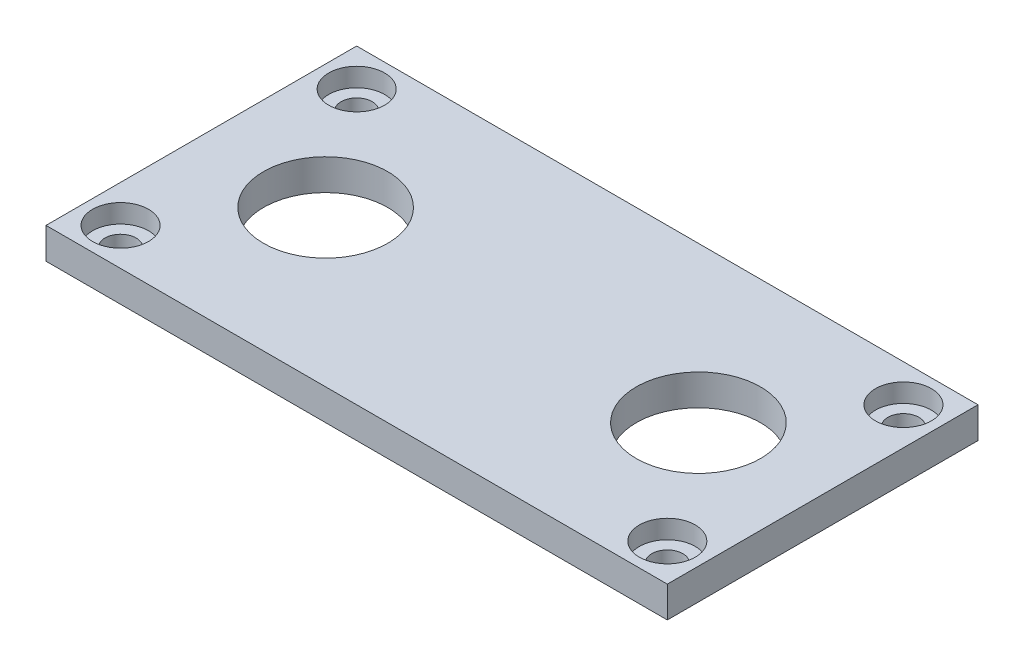
ISO-10303-21;
HEADER;
FILE_DESCRIPTION(('STEP AP214'),'2;1');
FILE_NAME('part.step','',(''),(''),'','','');
FILE_SCHEMA(('AUTOMOTIVE_DESIGN { 1 0 10303 214 1 1 1 1 }'));
ENDSEC;
DATA;
#1=APPLICATION_CONTEXT('core data for automotive mechanical design processes');
#2=APPLICATION_PROTOCOL_DEFINITION('international standard','automotive_design',2000,#1);
#3=PRODUCT_CONTEXT('',#1,'mechanical');
#4=PRODUCT('Part','Part','',(#3));
#5=PRODUCT_RELATED_PRODUCT_CATEGORY('part','',(#4));
#6=PRODUCT_DEFINITION_FORMATION('','',#4);
#7=PRODUCT_DEFINITION_CONTEXT('part definition',#1,'design');
#8=PRODUCT_DEFINITION('design','',#6,#7);
#9=PRODUCT_DEFINITION_SHAPE('','',#8);
#10=(LENGTH_UNIT() NAMED_UNIT(*) SI_UNIT(.MILLI.,.METRE.));
#11=(NAMED_UNIT(*) PLANE_ANGLE_UNIT() SI_UNIT($,.RADIAN.));
#12=(NAMED_UNIT(*) SI_UNIT($,.STERADIAN.) SOLID_ANGLE_UNIT());
#13=UNCERTAINTY_MEASURE_WITH_UNIT(LENGTH_MEASURE(1.E-05),#10,'distance_accuracy_value','');
#14=(GEOMETRIC_REPRESENTATION_CONTEXT(3) GLOBAL_UNCERTAINTY_ASSIGNED_CONTEXT((#13)) GLOBAL_UNIT_ASSIGNED_CONTEXT((#10,
#11,#12)) REPRESENTATION_CONTEXT('',''));
#15=CARTESIAN_POINT('',(0.,0.,0.));
#16=DIRECTION('',(0.,0.,1.));
#17=DIRECTION('',(1.,0.,0.));
#18=AXIS2_PLACEMENT_3D('',#15,#16,#17);
#19=CARTESIAN_POINT('',(44.,5.,-19.));
#20=DIRECTION('',(0.,-1.,0.));
#21=DIRECTION('',(0.,0.,-1.));
#22=AXIS2_PLACEMENT_3D('',#19,#20,#21);
#23=CYLINDRICAL_SURFACE('',#22,2.5);
#24=CARTESIAN_POINT('',(44.,0.,-19.));
#25=DIRECTION('',(0.,1.,0.));
#26=DIRECTION('',(0.,0.,1.));
#27=AXIS2_PLACEMENT_3D('',#24,#25,#26);
#28=CIRCLE('',#27,2.5);
#29=CARTESIAN_POINT('',(44.,0.,-16.5));
#30=VERTEX_POINT('',#29);
#31=EDGE_CURVE('E145',#30,#30,#28,.T.);
#32=ORIENTED_EDGE('',*,*,#31,.F.);
#33=EDGE_LOOP('',(#32));
#34=FACE_BOUND('',#33,.T.);
#35=CARTESIAN_POINT('',(44.,2.,-19.));
#36=DIRECTION('',(0.,1.,0.));
#37=DIRECTION('',(0.,0.,1.));
#38=AXIS2_PLACEMENT_3D('',#35,#36,#37);
#39=CIRCLE('',#38,2.5);
#40=CARTESIAN_POINT('',(44.,2.,-16.5));
#41=VERTEX_POINT('',#40);
#42=EDGE_CURVE('E44',#41,#41,#39,.T.);
#43=ORIENTED_EDGE('',*,*,#42,.T.);
#44=EDGE_LOOP('',(#43));
#45=FACE_BOUND('',#44,.T.);
#46=ADVANCED_FACE('F40',(#34,#45),#23,.F.);
#47=CARTESIAN_POINT('',(-44.,5.,-19.));
#48=DIRECTION('',(0.,-1.,0.));
#49=DIRECTION('',(0.,0.,-1.));
#50=AXIS2_PLACEMENT_3D('',#47,#48,#49);
#51=CYLINDRICAL_SURFACE('',#50,2.5);
#52=CARTESIAN_POINT('',(-44.,0.,-19.));
#53=DIRECTION('',(0.,1.,0.));
#54=DIRECTION('',(0.,0.,1.));
#55=AXIS2_PLACEMENT_3D('',#52,#53,#54);
#56=CIRCLE('',#55,2.5);
#57=CARTESIAN_POINT('',(-44.,0.,-16.5));
#58=VERTEX_POINT('',#57);
#59=EDGE_CURVE('E137',#58,#58,#56,.T.);
#60=ORIENTED_EDGE('',*,*,#59,.F.);
#61=EDGE_LOOP('',(#60));
#62=FACE_BOUND('',#61,.T.);
#63=CARTESIAN_POINT('',(-44.,2.,-19.));
#64=DIRECTION('',(0.,1.,0.));
#65=DIRECTION('',(0.,0.,1.));
#66=AXIS2_PLACEMENT_3D('',#63,#64,#65);
#67=CIRCLE('',#66,2.5);
#68=CARTESIAN_POINT('',(-44.,2.,-16.5));
#69=VERTEX_POINT('',#68);
#70=EDGE_CURVE('E123',#69,#69,#67,.T.);
#71=ORIENTED_EDGE('',*,*,#70,.T.);
#72=EDGE_LOOP('',(#71));
#73=FACE_BOUND('',#72,.T.);
#74=ADVANCED_FACE('F179',(#62,#73),#51,.F.);
#75=CARTESIAN_POINT('',(-44.,5.,19.));
#76=DIRECTION('',(0.,-1.,0.));
#77=DIRECTION('',(0.,0.,-1.));
#78=AXIS2_PLACEMENT_3D('',#75,#76,#77);
#79=CYLINDRICAL_SURFACE('',#78,2.5);
#80=CARTESIAN_POINT('',(-44.,0.,19.));
#81=DIRECTION('',(0.,1.,0.));
#82=DIRECTION('',(0.,0.,1.));
#83=AXIS2_PLACEMENT_3D('',#80,#81,#82);
#84=CIRCLE('',#83,2.5);
#85=CARTESIAN_POINT('',(-44.,0.,21.5));
#86=VERTEX_POINT('',#85);
#87=EDGE_CURVE('E132',#86,#86,#84,.T.);
#88=ORIENTED_EDGE('',*,*,#87,.F.);
#89=EDGE_LOOP('',(#88));
#90=FACE_BOUND('',#89,.T.);
#91=CARTESIAN_POINT('',(-44.,2.,19.));
#92=DIRECTION('',(0.,1.,0.));
#93=DIRECTION('',(0.,0.,1.));
#94=AXIS2_PLACEMENT_3D('',#91,#92,#93);
#95=CIRCLE('',#94,2.5);
#96=CARTESIAN_POINT('',(-44.,2.,21.5));
#97=VERTEX_POINT('',#96);
#98=EDGE_CURVE('E120',#97,#97,#95,.T.);
#99=ORIENTED_EDGE('',*,*,#98,.T.);
#100=EDGE_LOOP('',(#99));
#101=FACE_BOUND('',#100,.T.);
#102=ADVANCED_FACE('F185',(#90,#101),#79,.F.);
#103=CARTESIAN_POINT('',(44.,5.,19.));
#104=DIRECTION('',(0.,-1.,0.));
#105=DIRECTION('',(0.,0.,-1.));
#106=AXIS2_PLACEMENT_3D('',#103,#104,#105);
#107=CYLINDRICAL_SURFACE('',#106,2.5);
#108=CARTESIAN_POINT('',(44.,0.,19.));
#109=DIRECTION('',(0.,1.,0.));
#110=DIRECTION('',(0.,0.,1.));
#111=AXIS2_PLACEMENT_3D('',#108,#109,#110);
#112=CIRCLE('',#111,2.5);
#113=CARTESIAN_POINT('',(44.,0.,21.5));
#114=VERTEX_POINT('',#113);
#115=EDGE_CURVE('E128',#114,#114,#112,.T.);
#116=ORIENTED_EDGE('',*,*,#115,.F.);
#117=EDGE_LOOP('',(#116));
#118=FACE_BOUND('',#117,.T.);
#119=CARTESIAN_POINT('',(44.,2.,19.));
#120=DIRECTION('',(0.,1.,0.));
#121=DIRECTION('',(0.,0.,1.));
#122=AXIS2_PLACEMENT_3D('',#119,#120,#121);
#123=CIRCLE('',#122,2.5);
#124=CARTESIAN_POINT('',(44.,2.,21.5));
#125=VERTEX_POINT('',#124);
#126=EDGE_CURVE('E117',#125,#125,#123,.T.);
#127=ORIENTED_EDGE('',*,*,#126,.T.);
#128=EDGE_LOOP('',(#127));
#129=FACE_BOUND('',#128,.T.);
#130=ADVANCED_FACE('F192',(#118,#129),#107,.F.);
#131=CARTESIAN_POINT('',(0.,5.,0.));
#132=DIRECTION('',(0.,-1.,0.));
#133=DIRECTION('',(0.,0.,-1.));
#134=AXIS2_PLACEMENT_3D('',#131,#132,#133);
#135=PLANE('',#134);
#136=CARTESIAN_POINT('',(44.,5.,-19.));
#137=DIRECTION('',(0.,1.,0.));
#138=DIRECTION('',(0.,0.,1.));
#139=AXIS2_PLACEMENT_3D('',#136,#137,#138);
#140=CIRCLE('',#139,4.5);
#141=CARTESIAN_POINT('',(44.,5.,-14.5));
#142=VERTEX_POINT('',#141);
#143=EDGE_CURVE('E249',#142,#142,#140,.T.);
#144=ORIENTED_EDGE('',*,*,#143,.F.);
#145=EDGE_LOOP('',(#144));
#146=FACE_BOUND('',#145,.T.);
#147=CARTESIAN_POINT('',(44.,5.,19.));
#148=DIRECTION('',(0.,1.,0.));
#149=DIRECTION('',(0.,0.,1.));
#150=AXIS2_PLACEMENT_3D('',#147,#148,#149);
#151=CIRCLE('',#150,4.5);
#152=CARTESIAN_POINT('',(44.,5.,23.5));
#153=VERTEX_POINT('',#152);
#154=EDGE_CURVE('E243',#153,#153,#151,.T.);
#155=ORIENTED_EDGE('',*,*,#154,.F.);
#156=EDGE_LOOP('',(#155));
#157=FACE_BOUND('',#156,.T.);
#158=CARTESIAN_POINT('',(-44.,5.,19.));
#159=DIRECTION('',(0.,1.,0.));
#160=DIRECTION('',(0.,0.,1.));
#161=AXIS2_PLACEMENT_3D('',#158,#159,#160);
#162=CIRCLE('',#161,4.5);
#163=CARTESIAN_POINT('',(-44.,5.,23.5));
#164=VERTEX_POINT('',#163);
#165=EDGE_CURVE('E234',#164,#164,#162,.T.);
#166=ORIENTED_EDGE('',*,*,#165,.F.);
#167=EDGE_LOOP('',(#166));
#168=FACE_BOUND('',#167,.T.);
#169=CARTESIAN_POINT('',(-44.,5.,-19.));
#170=DIRECTION('',(0.,1.,0.));
#171=DIRECTION('',(0.,0.,1.));
#172=AXIS2_PLACEMENT_3D('',#169,#170,#171);
#173=CIRCLE('',#172,4.5);
#174=CARTESIAN_POINT('',(-44.,5.,-14.5));
#175=VERTEX_POINT('',#174);
#176=EDGE_CURVE('E140',#175,#175,#173,.T.);
#177=ORIENTED_EDGE('',*,*,#176,.F.);
#178=EDGE_LOOP('',(#177));
#179=FACE_BOUND('',#178,.T.);
#180=DIRECTION('',(0.,0.,1.));
#181=VECTOR('',#180,1.);
#182=CARTESIAN_POINT('',(-50.,5.,25.));
#183=LINE('',#182,#181);
#184=CARTESIAN_POINT('',(-50.,5.,-25.));
#185=VERTEX_POINT('',#184);
#186=CARTESIAN_POINT('',(-50.,5.,25.));
#187=VERTEX_POINT('',#186);
#188=EDGE_CURVE('E95',#185,#187,#183,.T.);
#189=ORIENTED_EDGE('',*,*,#188,.T.);
#190=DIRECTION('',(1.,0.,0.));
#191=VECTOR('',#190,1.);
#192=CARTESIAN_POINT('',(-50.,5.,25.));
#193=LINE('',#192,#191);
#194=CARTESIAN_POINT('',(50.,5.,25.));
#195=VERTEX_POINT('',#194);
#196=EDGE_CURVE('E89',#187,#195,#193,.T.);
#197=ORIENTED_EDGE('',*,*,#196,.T.);
#198=DIRECTION('',(0.,0.,-1.));
#199=VECTOR('',#198,1.);
#200=CARTESIAN_POINT('',(50.,5.,25.));
#201=LINE('',#200,#199);
#202=CARTESIAN_POINT('',(50.,5.,-25.));
#203=VERTEX_POINT('',#202);
#204=EDGE_CURVE('E93',#195,#203,#201,.T.);
#205=ORIENTED_EDGE('',*,*,#204,.T.);
#206=DIRECTION('',(-1.,0.,0.));
#207=VECTOR('',#206,1.);
#208=CARTESIAN_POINT('',(-50.,5.,-25.));
#209=LINE('',#208,#207);
#210=EDGE_CURVE('E59',#203,#185,#209,.T.);
#211=ORIENTED_EDGE('',*,*,#210,.T.);
#212=EDGE_LOOP('',(#189,#197,#205,#211));
#213=FACE_BOUND('',#212,.T.);
#214=CARTESIAN_POINT('',(30.,5.,0.));
#215=DIRECTION('',(0.,1.,0.));
#216=DIRECTION('',(0.,0.,1.));
#217=AXIS2_PLACEMENT_3D('',#214,#215,#216);
#218=CIRCLE('',#217,10.);
#219=CARTESIAN_POINT('',(30.,5.,10.));
#220=VERTEX_POINT('',#219);
#221=EDGE_CURVE('E111',#220,#220,#218,.T.);
#222=ORIENTED_EDGE('',*,*,#221,.F.);
#223=EDGE_LOOP('',(#222));
#224=FACE_BOUND('',#223,.T.);
#225=CARTESIAN_POINT('',(-30.,5.,0.));
#226=DIRECTION('',(0.,1.,0.));
#227=DIRECTION('',(0.,0.,1.));
#228=AXIS2_PLACEMENT_3D('',#225,#226,#227);
#229=CIRCLE('',#228,10.);
#230=CARTESIAN_POINT('',(-30.,5.,10.));
#231=VERTEX_POINT('',#230);
#232=EDGE_CURVE('E149',#231,#231,#229,.T.);
#233=ORIENTED_EDGE('',*,*,#232,.F.);
#234=EDGE_LOOP('',(#233));
#235=FACE_BOUND('',#234,.T.);
#236=ADVANCED_FACE('F90',(#146,#157,#168,#179,#213,#224,#235),#135,.F.);
#237=CARTESIAN_POINT('',(0.,0.,0.));
#238=DIRECTION('',(0.,-1.,0.));
#239=DIRECTION('',(0.,0.,-1.));
#240=AXIS2_PLACEMENT_3D('',#237,#238,#239);
#241=PLANE('',#240);
#242=ORIENTED_EDGE('',*,*,#87,.T.);
#243=EDGE_LOOP('',(#242));
#244=FACE_BOUND('',#243,.T.);
#245=ORIENTED_EDGE('',*,*,#31,.T.);
#246=EDGE_LOOP('',(#245));
#247=FACE_BOUND('',#246,.T.);
#248=CARTESIAN_POINT('',(30.,0.,0.));
#249=DIRECTION('',(0.,1.,0.));
#250=DIRECTION('',(0.,0.,1.));
#251=AXIS2_PLACEMENT_3D('',#248,#249,#250);
#252=CIRCLE('',#251,10.);
#253=CARTESIAN_POINT('',(30.,0.,10.));
#254=VERTEX_POINT('',#253);
#255=EDGE_CURVE('E152',#254,#254,#252,.T.);
#256=ORIENTED_EDGE('',*,*,#255,.T.);
#257=EDGE_LOOP('',(#256));
#258=FACE_BOUND('',#257,.T.);
#259=DIRECTION('',(0.,0.,1.));
#260=VECTOR('',#259,1.);
#261=CARTESIAN_POINT('',(-50.,0.,25.));
#262=LINE('',#261,#260);
#263=CARTESIAN_POINT('',(-50.,0.,-25.));
#264=VERTEX_POINT('',#263);
#265=CARTESIAN_POINT('',(-50.,0.,25.));
#266=VERTEX_POINT('',#265);
#267=EDGE_CURVE('E108',#264,#266,#262,.T.);
#268=ORIENTED_EDGE('',*,*,#267,.F.);
#269=DIRECTION('',(-1.,0.,0.));
#270=VECTOR('',#269,1.);
#271=CARTESIAN_POINT('',(-50.,0.,-25.));
#272=LINE('',#271,#270);
#273=CARTESIAN_POINT('',(50.,0.,-25.));
#274=VERTEX_POINT('',#273);
#275=EDGE_CURVE('E82',#274,#264,#272,.T.);
#276=ORIENTED_EDGE('',*,*,#275,.F.);
#277=DIRECTION('',(0.,0.,-1.));
#278=VECTOR('',#277,1.);
#279=CARTESIAN_POINT('',(50.,0.,25.));
#280=LINE('',#279,#278);
#281=CARTESIAN_POINT('',(50.,0.,25.));
#282=VERTEX_POINT('',#281);
#283=EDGE_CURVE('E76',#282,#274,#280,.T.);
#284=ORIENTED_EDGE('',*,*,#283,.F.);
#285=DIRECTION('',(1.,0.,0.));
#286=VECTOR('',#285,1.);
#287=CARTESIAN_POINT('',(-50.,0.,25.));
#288=LINE('',#287,#286);
#289=EDGE_CURVE('E99',#266,#282,#288,.T.);
#290=ORIENTED_EDGE('',*,*,#289,.F.);
#291=EDGE_LOOP('',(#268,#276,#284,#290));
#292=FACE_BOUND('',#291,.T.);
#293=CARTESIAN_POINT('',(-30.,0.,0.));
#294=DIRECTION('',(0.,1.,0.));
#295=DIRECTION('',(0.,0.,1.));
#296=AXIS2_PLACEMENT_3D('',#293,#294,#295);
#297=CIRCLE('',#296,10.);
#298=CARTESIAN_POINT('',(-30.,0.,10.));
#299=VERTEX_POINT('',#298);
#300=EDGE_CURVE('E148',#299,#299,#297,.T.);
#301=ORIENTED_EDGE('',*,*,#300,.T.);
#302=EDGE_LOOP('',(#301));
#303=FACE_BOUND('',#302,.T.);
#304=ORIENTED_EDGE('',*,*,#59,.T.);
#305=EDGE_LOOP('',(#304));
#306=FACE_BOUND('',#305,.T.);
#307=ORIENTED_EDGE('',*,*,#115,.T.);
#308=EDGE_LOOP('',(#307));
#309=FACE_BOUND('',#308,.T.);
#310=ADVANCED_FACE('F160',(#244,#247,#258,#292,#303,#306,#309),#241,.T.);
#311=CARTESIAN_POINT('',(-50.,5.,25.));
#312=DIRECTION('',(1.,0.,0.));
#313=DIRECTION('',(0.,0.,-1.));
#314=AXIS2_PLACEMENT_3D('',#311,#312,#313);
#315=PLANE('',#314);
#316=ORIENTED_EDGE('',*,*,#267,.T.);
#317=DIRECTION('',(0.,-1.,0.));
#318=VECTOR('',#317,1.);
#319=CARTESIAN_POINT('',(-50.,5.,25.));
#320=LINE('',#319,#318);
#321=EDGE_CURVE('E11',#187,#266,#320,.T.);
#322=ORIENTED_EDGE('',*,*,#321,.F.);
#323=ORIENTED_EDGE('',*,*,#188,.F.);
#324=DIRECTION('',(0.,-1.,0.));
#325=VECTOR('',#324,1.);
#326=CARTESIAN_POINT('',(-50.,5.,-25.));
#327=LINE('',#326,#325);
#328=EDGE_CURVE('E104',#185,#264,#327,.T.);
#329=ORIENTED_EDGE('',*,*,#328,.T.);
#330=EDGE_LOOP('',(#316,#322,#323,#329));
#331=FACE_BOUND('',#330,.T.);
#332=ADVANCED_FACE('F42',(#331),#315,.F.);
#333=CARTESIAN_POINT('',(-50.,5.,25.));
#334=DIRECTION('',(0.,0.,-1.));
#335=DIRECTION('',(-1.,0.,0.));
#336=AXIS2_PLACEMENT_3D('',#333,#334,#335);
#337=PLANE('',#336);
#338=ORIENTED_EDGE('',*,*,#289,.T.);
#339=DIRECTION('',(0.,-1.,0.));
#340=VECTOR('',#339,1.);
#341=CARTESIAN_POINT('',(50.,5.,25.));
#342=LINE('',#341,#340);
#343=EDGE_CURVE('E50',#195,#282,#342,.T.);
#344=ORIENTED_EDGE('',*,*,#343,.F.);
#345=ORIENTED_EDGE('',*,*,#196,.F.);
#346=ORIENTED_EDGE('',*,*,#321,.T.);
#347=EDGE_LOOP('',(#338,#344,#345,#346));
#348=FACE_BOUND('',#347,.T.);
#349=ADVANCED_FACE('F98',(#348),#337,.F.);
#350=CARTESIAN_POINT('',(50.,5.,25.));
#351=DIRECTION('',(-1.,0.,0.));
#352=DIRECTION('',(0.,0.,1.));
#353=AXIS2_PLACEMENT_3D('',#350,#351,#352);
#354=PLANE('',#353);
#355=ORIENTED_EDGE('',*,*,#283,.T.);
#356=DIRECTION('',(0.,-1.,0.));
#357=VECTOR('',#356,1.);
#358=CARTESIAN_POINT('',(50.,5.,-25.));
#359=LINE('',#358,#357);
#360=EDGE_CURVE('E100',#203,#274,#359,.T.);
#361=ORIENTED_EDGE('',*,*,#360,.F.);
#362=ORIENTED_EDGE('',*,*,#204,.F.);
#363=ORIENTED_EDGE('',*,*,#343,.T.);
#364=EDGE_LOOP('',(#355,#361,#362,#363));
#365=FACE_BOUND('',#364,.T.);
#366=ADVANCED_FACE('F102',(#365),#354,.F.);
#367=CARTESIAN_POINT('',(-50.,5.,-25.));
#368=DIRECTION('',(0.,0.,1.));
#369=DIRECTION('',(1.,0.,0.));
#370=AXIS2_PLACEMENT_3D('',#367,#368,#369);
#371=PLANE('',#370);
#372=ORIENTED_EDGE('',*,*,#275,.T.);
#373=ORIENTED_EDGE('',*,*,#328,.F.);
#374=ORIENTED_EDGE('',*,*,#210,.F.);
#375=ORIENTED_EDGE('',*,*,#360,.T.);
#376=EDGE_LOOP('',(#372,#373,#374,#375));
#377=FACE_BOUND('',#376,.T.);
#378=ADVANCED_FACE('F166',(#377),#371,.F.);
#379=CARTESIAN_POINT('',(30.,5.,0.));
#380=DIRECTION('',(0.,-1.,0.));
#381=DIRECTION('',(0.,0.,-1.));
#382=AXIS2_PLACEMENT_3D('',#379,#380,#381);
#383=CYLINDRICAL_SURFACE('',#382,10.);
#384=ORIENTED_EDGE('',*,*,#221,.T.);
#385=EDGE_LOOP('',(#384));
#386=FACE_BOUND('',#385,.T.);
#387=ORIENTED_EDGE('',*,*,#255,.F.);
#388=EDGE_LOOP('',(#387));
#389=FACE_BOUND('',#388,.T.);
#390=ADVANCED_FACE('F163',(#386,#389),#383,.F.);
#391=CARTESIAN_POINT('',(-30.,5.,0.));
#392=DIRECTION('',(0.,-1.,0.));
#393=DIRECTION('',(0.,0.,-1.));
#394=AXIS2_PLACEMENT_3D('',#391,#392,#393);
#395=CYLINDRICAL_SURFACE('',#394,10.);
#396=ORIENTED_EDGE('',*,*,#232,.T.);
#397=EDGE_LOOP('',(#396));
#398=FACE_BOUND('',#397,.T.);
#399=ORIENTED_EDGE('',*,*,#300,.F.);
#400=EDGE_LOOP('',(#399));
#401=FACE_BOUND('',#400,.T.);
#402=ADVANCED_FACE('F165',(#398,#401),#395,.F.);
#403=CARTESIAN_POINT('',(44.,2.,19.));
#404=DIRECTION('',(0.,1.,0.));
#405=DIRECTION('',(0.,0.,1.));
#406=AXIS2_PLACEMENT_3D('',#403,#404,#405);
#407=CYLINDRICAL_SURFACE('',#406,4.5);
#408=CARTESIAN_POINT('',(44.,2.,19.));
#409=DIRECTION('',(0.,1.,0.));
#410=DIRECTION('',(0.,0.,1.));
#411=AXIS2_PLACEMENT_3D('',#408,#409,#410);
#412=CIRCLE('',#411,4.5);
#413=CARTESIAN_POINT('',(44.,2.,23.5));
#414=VERTEX_POINT('',#413);
#415=EDGE_CURVE('E238',#414,#414,#412,.T.);
#416=ORIENTED_EDGE('',*,*,#415,.F.);
#417=EDGE_LOOP('',(#416));
#418=FACE_BOUND('',#417,.T.);
#419=ORIENTED_EDGE('',*,*,#154,.T.);
#420=EDGE_LOOP('',(#419));
#421=FACE_BOUND('',#420,.T.);
#422=ADVANCED_FACE('F173',(#418,#421),#407,.F.);
#423=CARTESIAN_POINT('',(44.,2.,19.));
#424=DIRECTION('',(0.,1.,0.));
#425=DIRECTION('',(0.,0.,1.));
#426=AXIS2_PLACEMENT_3D('',#423,#424,#425);
#427=PLANE('',#426);
#428=ORIENTED_EDGE('',*,*,#126,.F.);
#429=EDGE_LOOP('',(#428));
#430=FACE_BOUND('',#429,.T.);
#431=ORIENTED_EDGE('',*,*,#415,.T.);
#432=EDGE_LOOP('',(#431));
#433=FACE_BOUND('',#432,.T.);
#434=ADVANCED_FACE('F216',(#430,#433),#427,.T.);
#435=CARTESIAN_POINT('',(-44.,2.,19.));
#436=DIRECTION('',(0.,1.,0.));
#437=DIRECTION('',(0.,0.,1.));
#438=AXIS2_PLACEMENT_3D('',#435,#436,#437);
#439=CYLINDRICAL_SURFACE('',#438,4.5);
#440=CARTESIAN_POINT('',(-44.,2.,19.));
#441=DIRECTION('',(0.,1.,0.));
#442=DIRECTION('',(0.,0.,1.));
#443=AXIS2_PLACEMENT_3D('',#440,#441,#442);
#444=CIRCLE('',#443,4.5);
#445=CARTESIAN_POINT('',(-44.,2.,23.5));
#446=VERTEX_POINT('',#445);
#447=EDGE_CURVE('E233',#446,#446,#444,.T.);
#448=ORIENTED_EDGE('',*,*,#447,.F.);
#449=EDGE_LOOP('',(#448));
#450=FACE_BOUND('',#449,.T.);
#451=ORIENTED_EDGE('',*,*,#165,.T.);
#452=EDGE_LOOP('',(#451));
#453=FACE_BOUND('',#452,.T.);
#454=ADVANCED_FACE('F220',(#450,#453),#439,.F.);
#455=CARTESIAN_POINT('',(-44.,2.,19.));
#456=DIRECTION('',(0.,1.,0.));
#457=DIRECTION('',(0.,0.,1.));
#458=AXIS2_PLACEMENT_3D('',#455,#456,#457);
#459=PLANE('',#458);
#460=ORIENTED_EDGE('',*,*,#98,.F.);
#461=EDGE_LOOP('',(#460));
#462=FACE_BOUND('',#461,.T.);
#463=ORIENTED_EDGE('',*,*,#447,.T.);
#464=EDGE_LOOP('',(#463));
#465=FACE_BOUND('',#464,.T.);
#466=ADVANCED_FACE('F201',(#462,#465),#459,.T.);
#467=CARTESIAN_POINT('',(-44.,2.,-19.));
#468=DIRECTION('',(0.,1.,0.));
#469=DIRECTION('',(0.,0.,1.));
#470=AXIS2_PLACEMENT_3D('',#467,#468,#469);
#471=CYLINDRICAL_SURFACE('',#470,4.5);
#472=CARTESIAN_POINT('',(-44.,2.,-19.));
#473=DIRECTION('',(0.,1.,0.));
#474=DIRECTION('',(0.,0.,1.));
#475=AXIS2_PLACEMENT_3D('',#472,#473,#474);
#476=CIRCLE('',#475,4.5);
#477=CARTESIAN_POINT('',(-44.,2.,-14.5));
#478=VERTEX_POINT('',#477);
#479=EDGE_CURVE('E121',#478,#478,#476,.T.);
#480=ORIENTED_EDGE('',*,*,#479,.F.);
#481=EDGE_LOOP('',(#480));
#482=FACE_BOUND('',#481,.T.);
#483=ORIENTED_EDGE('',*,*,#176,.T.);
#484=EDGE_LOOP('',(#483));
#485=FACE_BOUND('',#484,.T.);
#486=ADVANCED_FACE('F197',(#482,#485),#471,.F.);
#487=CARTESIAN_POINT('',(-44.,2.,-19.));
#488=DIRECTION('',(0.,1.,0.));
#489=DIRECTION('',(0.,0.,1.));
#490=AXIS2_PLACEMENT_3D('',#487,#488,#489);
#491=PLANE('',#490);
#492=ORIENTED_EDGE('',*,*,#70,.F.);
#493=EDGE_LOOP('',(#492));
#494=FACE_BOUND('',#493,.T.);
#495=ORIENTED_EDGE('',*,*,#479,.T.);
#496=EDGE_LOOP('',(#495));
#497=FACE_BOUND('',#496,.T.);
#498=ADVANCED_FACE('F200',(#494,#497),#491,.T.);
#499=CARTESIAN_POINT('',(44.,2.,-19.));
#500=DIRECTION('',(0.,1.,0.));
#501=DIRECTION('',(0.,0.,1.));
#502=AXIS2_PLACEMENT_3D('',#499,#500,#501);
#503=CYLINDRICAL_SURFACE('',#502,4.5);
#504=CARTESIAN_POINT('',(44.,2.,-19.));
#505=DIRECTION('',(0.,1.,0.));
#506=DIRECTION('',(0.,0.,1.));
#507=AXIS2_PLACEMENT_3D('',#504,#505,#506);
#508=CIRCLE('',#507,4.5);
#509=CARTESIAN_POINT('',(44.,2.,-14.5));
#510=VERTEX_POINT('',#509);
#511=EDGE_CURVE('E246',#510,#510,#508,.T.);
#512=ORIENTED_EDGE('',*,*,#511,.F.);
#513=EDGE_LOOP('',(#512));
#514=FACE_BOUND('',#513,.T.);
#515=ORIENTED_EDGE('',*,*,#143,.T.);
#516=EDGE_LOOP('',(#515));
#517=FACE_BOUND('',#516,.T.);
#518=ADVANCED_FACE('F205',(#514,#517),#503,.F.);
#519=CARTESIAN_POINT('',(44.,2.,-19.));
#520=DIRECTION('',(0.,1.,0.));
#521=DIRECTION('',(0.,0.,1.));
#522=AXIS2_PLACEMENT_3D('',#519,#520,#521);
#523=PLANE('',#522);
#524=ORIENTED_EDGE('',*,*,#42,.F.);
#525=EDGE_LOOP('',(#524));
#526=FACE_BOUND('',#525,.T.);
#527=ORIENTED_EDGE('',*,*,#511,.T.);
#528=EDGE_LOOP('',(#527));
#529=FACE_BOUND('',#528,.T.);
#530=ADVANCED_FACE('F209',(#526,#529),#523,.T.);
#531=CLOSED_SHELL('',(#46,#74,#102,#130,#236,#310,#332,#349,#366,#378,#390,#402,#422,#434,#454,
#466,#486,#498,#518,#530));
#532=MANIFOLD_SOLID_BREP('B2',#531);
#533=ADVANCED_BREP_SHAPE_REPRESENTATION('',(#18,#532),#14);
#534=SHAPE_DEFINITION_REPRESENTATION(#9,#533);
ENDSEC;
END-ISO-10303-21;
